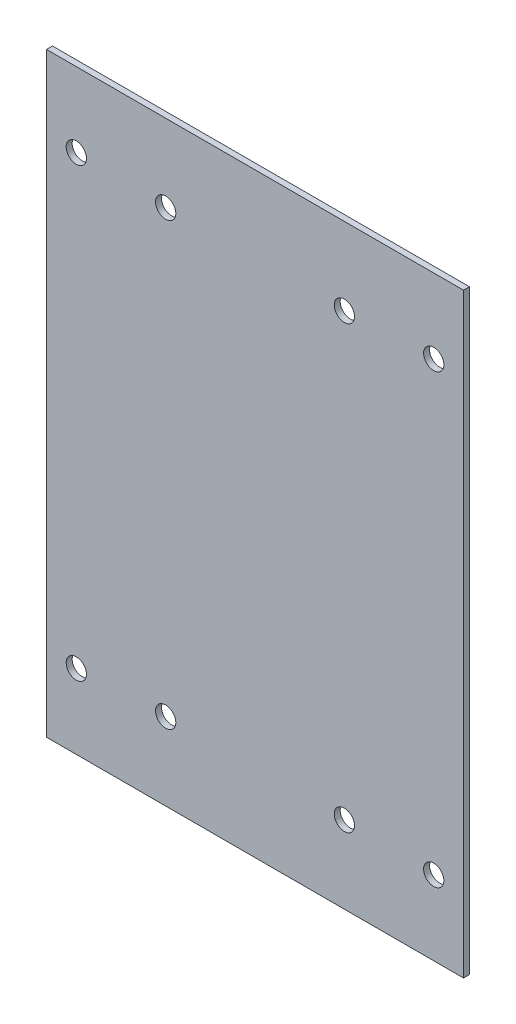
ISO-10303-21;
HEADER;
FILE_DESCRIPTION(('STEP AP214'),'2;1');
FILE_NAME('part.step','',(''),(''),'','','');
FILE_SCHEMA(('AUTOMOTIVE_DESIGN { 1 0 10303 214 1 1 1 1 }'));
ENDSEC;
DATA;
#1=APPLICATION_CONTEXT('core data for automotive mechanical design processes');
#2=APPLICATION_PROTOCOL_DEFINITION('international standard','automotive_design',2000,#1);
#3=PRODUCT_CONTEXT('',#1,'mechanical');
#4=PRODUCT('Part','Part','',(#3));
#5=PRODUCT_RELATED_PRODUCT_CATEGORY('part','',(#4));
#6=PRODUCT_DEFINITION_FORMATION('','',#4);
#7=PRODUCT_DEFINITION_CONTEXT('part definition',#1,'design');
#8=PRODUCT_DEFINITION('design','',#6,#7);
#9=PRODUCT_DEFINITION_SHAPE('','',#8);
#10=(LENGTH_UNIT() NAMED_UNIT(*) SI_UNIT(.MILLI.,.METRE.));
#11=(NAMED_UNIT(*) PLANE_ANGLE_UNIT() SI_UNIT($,.RADIAN.));
#12=(NAMED_UNIT(*) SI_UNIT($,.STERADIAN.) SOLID_ANGLE_UNIT());
#13=UNCERTAINTY_MEASURE_WITH_UNIT(LENGTH_MEASURE(1.E-05),#10,'distance_accuracy_value','');
#14=(GEOMETRIC_REPRESENTATION_CONTEXT(3) GLOBAL_UNCERTAINTY_ASSIGNED_CONTEXT((#13)) GLOBAL_UNIT_ASSIGNED_CONTEXT((#10,
#11,#12)) REPRESENTATION_CONTEXT('',''));
#15=CARTESIAN_POINT('',(0.,0.,0.));
#16=DIRECTION('',(0.,0.,1.));
#17=DIRECTION('',(1.,0.,0.));
#18=AXIS2_PLACEMENT_3D('',#15,#16,#17);
#19=CARTESIAN_POINT('',(0.,0.,0.));
#20=DIRECTION('',(0.,0.,-1.));
#21=DIRECTION('',(-1.,0.,0.));
#22=AXIS2_PLACEMENT_3D('',#19,#20,#21);
#23=PLANE('',#22);
#24=CARTESIAN_POINT('',(-15.,37.,0.));
#25=DIRECTION('',(0.,0.,-1.));
#26=DIRECTION('',(-1.,0.,0.));
#27=AXIS2_PLACEMENT_3D('',#24,#25,#26);
#28=CIRCLE('',#27,1.7);
#29=CARTESIAN_POINT('',(-16.7,37.,0.));
#30=VERTEX_POINT('',#29);
#31=EDGE_CURVE('E267',#30,#30,#28,.F.);
#32=ORIENTED_EDGE('',*,*,#31,.F.);
#33=EDGE_LOOP('',(#32));
#34=FACE_BOUND('',#33,.T.);
#35=CARTESIAN_POINT('',(15.,-37.,0.));
#36=DIRECTION('',(0.,0.,-1.));
#37=DIRECTION('',(-1.,0.,0.));
#38=AXIS2_PLACEMENT_3D('',#35,#36,#37);
#39=CIRCLE('',#38,1.7);
#40=CARTESIAN_POINT('',(13.3,-37.,0.));
#41=VERTEX_POINT('',#40);
#42=EDGE_CURVE('E272',#41,#41,#39,.F.);
#43=ORIENTED_EDGE('',*,*,#42,.F.);
#44=EDGE_LOOP('',(#43));
#45=FACE_BOUND('',#44,.T.);
#46=CARTESIAN_POINT('',(15.,37.,0.));
#47=DIRECTION('',(0.,0.,-1.));
#48=DIRECTION('',(-1.,0.,0.));
#49=AXIS2_PLACEMENT_3D('',#46,#47,#48);
#50=CIRCLE('',#49,1.7);
#51=CARTESIAN_POINT('',(13.3,37.,0.));
#52=VERTEX_POINT('',#51);
#53=EDGE_CURVE('E277',#52,#52,#50,.F.);
#54=ORIENTED_EDGE('',*,*,#53,.F.);
#55=EDGE_LOOP('',(#54));
#56=FACE_BOUND('',#55,.T.);
#57=CARTESIAN_POINT('',(-15.,-37.,0.));
#58=DIRECTION('',(0.,0.,-1.));
#59=DIRECTION('',(-1.,0.,0.));
#60=AXIS2_PLACEMENT_3D('',#57,#58,#59);
#61=CIRCLE('',#60,1.7);
#62=CARTESIAN_POINT('',(-16.7,-37.,0.));
#63=VERTEX_POINT('',#62);
#64=EDGE_CURVE('E276',#63,#63,#61,.F.);
#65=ORIENTED_EDGE('',*,*,#64,.F.);
#66=EDGE_LOOP('',(#65));
#67=FACE_BOUND('',#66,.T.);
#68=DIRECTION('',(0.,1.,0.));
#69=VECTOR('',#68,1.);
#70=CARTESIAN_POINT('',(35.,-50.,0.));
#71=LINE('',#70,#69);
#72=CARTESIAN_POINT('',(35.,-50.,0.));
#73=VERTEX_POINT('',#72);
#74=CARTESIAN_POINT('',(35.,50.,0.));
#75=VERTEX_POINT('',#74);
#76=EDGE_CURVE('E108',#73,#75,#71,.T.);
#77=ORIENTED_EDGE('',*,*,#76,.T.);
#78=DIRECTION('',(-1.,0.,0.));
#79=VECTOR('',#78,1.);
#80=CARTESIAN_POINT('',(-35.,50.,0.));
#81=LINE('',#80,#79);
#82=CARTESIAN_POINT('',(-35.,50.,0.));
#83=VERTEX_POINT('',#82);
#84=EDGE_CURVE('E115',#75,#83,#81,.T.);
#85=ORIENTED_EDGE('',*,*,#84,.T.);
#86=DIRECTION('',(0.,-1.,0.));
#87=VECTOR('',#86,1.);
#88=CARTESIAN_POINT('',(-35.,-50.,0.));
#89=LINE('',#88,#87);
#90=CARTESIAN_POINT('',(-35.,-50.,0.));
#91=VERTEX_POINT('',#90);
#92=EDGE_CURVE('E91',#83,#91,#89,.T.);
#93=ORIENTED_EDGE('',*,*,#92,.T.);
#94=DIRECTION('',(1.,0.,0.));
#95=VECTOR('',#94,1.);
#96=CARTESIAN_POINT('',(-35.,-50.,0.));
#97=LINE('',#96,#95);
#98=EDGE_CURVE('E102',#91,#73,#97,.T.);
#99=ORIENTED_EDGE('',*,*,#98,.T.);
#100=EDGE_LOOP('',(#77,#85,#93,#99));
#101=FACE_BOUND('',#100,.T.);
#102=CARTESIAN_POINT('',(-30.,-37.5,1.2E-05));
#103=DIRECTION('',(0.,0.,1.));
#104=DIRECTION('',(1.,0.,0.));
#105=AXIS2_PLACEMENT_3D('',#102,#103,#104);
#106=CIRCLE('',#105,1.7);
#107=CARTESIAN_POINT('',(-28.3,-37.5,1.2E-05));
#108=VERTEX_POINT('',#107);
#109=EDGE_CURVE('E114',#108,#108,#106,.T.);
#110=ORIENTED_EDGE('',*,*,#109,.F.);
#111=EDGE_LOOP('',(#110));
#112=FACE_BOUND('',#111,.T.);
#113=CARTESIAN_POINT('',(30.,37.5,1.2E-05));
#114=DIRECTION('',(0.,0.,1.));
#115=DIRECTION('',(1.,0.,0.));
#116=AXIS2_PLACEMENT_3D('',#113,#114,#115);
#117=CIRCLE('',#116,1.7);
#118=CARTESIAN_POINT('',(31.7,37.5,1.2E-05));
#119=VERTEX_POINT('',#118);
#120=EDGE_CURVE('E222',#119,#119,#117,.T.);
#121=ORIENTED_EDGE('',*,*,#120,.F.);
#122=EDGE_LOOP('',(#121));
#123=FACE_BOUND('',#122,.T.);
#124=CARTESIAN_POINT('',(30.,-37.5,1.2E-05));
#125=DIRECTION('',(0.,0.,1.));
#126=DIRECTION('',(1.,0.,0.));
#127=AXIS2_PLACEMENT_3D('',#124,#125,#126);
#128=CIRCLE('',#127,1.7);
#129=CARTESIAN_POINT('',(31.7,-37.5,1.2E-05));
#130=VERTEX_POINT('',#129);
#131=EDGE_CURVE('E160',#130,#130,#128,.T.);
#132=ORIENTED_EDGE('',*,*,#131,.F.);
#133=EDGE_LOOP('',(#132));
#134=FACE_BOUND('',#133,.T.);
#135=CARTESIAN_POINT('',(-30.,37.5,1.2E-05));
#136=DIRECTION('',(0.,0.,1.));
#137=DIRECTION('',(1.,0.,0.));
#138=AXIS2_PLACEMENT_3D('',#135,#136,#137);
#139=CIRCLE('',#138,1.7);
#140=CARTESIAN_POINT('',(-28.3,37.5,1.2E-05));
#141=VERTEX_POINT('',#140);
#142=EDGE_CURVE('E169',#141,#141,#139,.T.);
#143=ORIENTED_EDGE('',*,*,#142,.F.);
#144=EDGE_LOOP('',(#143));
#145=FACE_BOUND('',#144,.T.);
#146=ADVANCED_FACE('F39',(#34,#45,#56,#67,#101,#112,#123,#134,#145),#23,.F.);
#147=CARTESIAN_POINT('',(35.,-50.,-1.));
#148=DIRECTION('',(1.,0.,0.));
#149=DIRECTION('',(0.,0.,-1.));
#150=AXIS2_PLACEMENT_3D('',#147,#148,#149);
#151=PLANE('',#150);
#152=ORIENTED_EDGE('',*,*,#76,.F.);
#153=DIRECTION('',(0.,0.,1.));
#154=VECTOR('',#153,1.);
#155=CARTESIAN_POINT('',(35.,-50.,-1.));
#156=LINE('',#155,#154);
#157=CARTESIAN_POINT('',(35.,-50.,-1.));
#158=VERTEX_POINT('',#157);
#159=EDGE_CURVE('E11',#158,#73,#156,.T.);
#160=ORIENTED_EDGE('',*,*,#159,.F.);
#161=DIRECTION('',(0.,1.,0.));
#162=VECTOR('',#161,1.);
#163=CARTESIAN_POINT('',(35.,-50.,-1.));
#164=LINE('',#163,#162);
#165=CARTESIAN_POINT('',(35.,50.,-1.));
#166=VERTEX_POINT('',#165);
#167=EDGE_CURVE('E105',#158,#166,#164,.T.);
#168=ORIENTED_EDGE('',*,*,#167,.T.);
#169=DIRECTION('',(0.,0.,1.));
#170=VECTOR('',#169,1.);
#171=CARTESIAN_POINT('',(35.,50.,-1.));
#172=LINE('',#171,#170);
#173=EDGE_CURVE('E83',#166,#75,#172,.T.);
#174=ORIENTED_EDGE('',*,*,#173,.T.);
#175=EDGE_LOOP('',(#152,#160,#168,#174));
#176=FACE_BOUND('',#175,.T.);
#177=ADVANCED_FACE('F41',(#176),#151,.T.);
#178=CARTESIAN_POINT('',(-35.,-50.,-1.));
#179=DIRECTION('',(0.,-1.,0.));
#180=DIRECTION('',(0.,0.,-1.));
#181=AXIS2_PLACEMENT_3D('',#178,#179,#180);
#182=PLANE('',#181);
#183=ORIENTED_EDGE('',*,*,#98,.F.);
#184=DIRECTION('',(0.,0.,1.));
#185=VECTOR('',#184,1.);
#186=CARTESIAN_POINT('',(-35.,-50.,-1.));
#187=LINE('',#186,#185);
#188=CARTESIAN_POINT('',(-35.,-50.,-1.));
#189=VERTEX_POINT('',#188);
#190=EDGE_CURVE('E51',#189,#91,#187,.T.);
#191=ORIENTED_EDGE('',*,*,#190,.F.);
#192=DIRECTION('',(1.,0.,0.));
#193=VECTOR('',#192,1.);
#194=CARTESIAN_POINT('',(-35.,-50.,-1.));
#195=LINE('',#194,#193);
#196=EDGE_CURVE('E97',#189,#158,#195,.T.);
#197=ORIENTED_EDGE('',*,*,#196,.T.);
#198=ORIENTED_EDGE('',*,*,#159,.T.);
#199=EDGE_LOOP('',(#183,#191,#197,#198));
#200=FACE_BOUND('',#199,.T.);
#201=ADVANCED_FACE('F138',(#200),#182,.T.);
#202=CARTESIAN_POINT('',(-35.,-50.,-1.));
#203=DIRECTION('',(-1.,0.,0.));
#204=DIRECTION('',(0.,0.,1.));
#205=AXIS2_PLACEMENT_3D('',#202,#203,#204);
#206=PLANE('',#205);
#207=ORIENTED_EDGE('',*,*,#92,.F.);
#208=DIRECTION('',(0.,0.,1.));
#209=VECTOR('',#208,1.);
#210=CARTESIAN_POINT('',(-35.,50.,-1.));
#211=LINE('',#210,#209);
#212=CARTESIAN_POINT('',(-35.,50.,-1.));
#213=VERTEX_POINT('',#212);
#214=EDGE_CURVE('E86',#213,#83,#211,.T.);
#215=ORIENTED_EDGE('',*,*,#214,.F.);
#216=DIRECTION('',(0.,-1.,0.));
#217=VECTOR('',#216,1.);
#218=CARTESIAN_POINT('',(-35.,-50.,-1.));
#219=LINE('',#218,#217);
#220=EDGE_CURVE('E93',#213,#189,#219,.T.);
#221=ORIENTED_EDGE('',*,*,#220,.T.);
#222=ORIENTED_EDGE('',*,*,#190,.T.);
#223=EDGE_LOOP('',(#207,#215,#221,#222));
#224=FACE_BOUND('',#223,.T.);
#225=ADVANCED_FACE('F89',(#224),#206,.T.);
#226=CARTESIAN_POINT('',(-35.,50.,-1.));
#227=DIRECTION('',(0.,1.,0.));
#228=DIRECTION('',(0.,0.,1.));
#229=AXIS2_PLACEMENT_3D('',#226,#227,#228);
#230=PLANE('',#229);
#231=ORIENTED_EDGE('',*,*,#84,.F.);
#232=ORIENTED_EDGE('',*,*,#173,.F.);
#233=DIRECTION('',(-1.,0.,0.));
#234=VECTOR('',#233,1.);
#235=CARTESIAN_POINT('',(-35.,50.,-1.));
#236=LINE('',#235,#234);
#237=EDGE_CURVE('E98',#166,#213,#236,.T.);
#238=ORIENTED_EDGE('',*,*,#237,.T.);
#239=ORIENTED_EDGE('',*,*,#214,.T.);
#240=EDGE_LOOP('',(#231,#232,#238,#239));
#241=FACE_BOUND('',#240,.T.);
#242=ADVANCED_FACE('F101',(#241),#230,.T.);
#243=CARTESIAN_POINT('',(0.,0.,-1.));
#244=DIRECTION('',(0.,0.,-1.));
#245=DIRECTION('',(-1.,0.,0.));
#246=AXIS2_PLACEMENT_3D('',#243,#244,#245);
#247=PLANE('',#246);
#248=CARTESIAN_POINT('',(-15.,37.,-1.));
#249=DIRECTION('',(0.,0.,1.));
#250=DIRECTION('',(1.,0.,0.));
#251=AXIS2_PLACEMENT_3D('',#248,#249,#250);
#252=CIRCLE('',#251,1.7);
#253=CARTESIAN_POINT('',(-13.3,37.,-1.));
#254=VERTEX_POINT('',#253);
#255=EDGE_CURVE('E253',#254,#254,#252,.T.);
#256=ORIENTED_EDGE('',*,*,#255,.T.);
#257=EDGE_LOOP('',(#256));
#258=FACE_BOUND('',#257,.T.);
#259=CARTESIAN_POINT('',(15.,-37.,-1.));
#260=DIRECTION('',(0.,0.,1.));
#261=DIRECTION('',(1.,0.,0.));
#262=AXIS2_PLACEMENT_3D('',#259,#260,#261);
#263=CIRCLE('',#262,1.7);
#264=CARTESIAN_POINT('',(16.7,-37.,-1.));
#265=VERTEX_POINT('',#264);
#266=EDGE_CURVE('E254',#265,#265,#263,.T.);
#267=ORIENTED_EDGE('',*,*,#266,.T.);
#268=EDGE_LOOP('',(#267));
#269=FACE_BOUND('',#268,.T.);
#270=CARTESIAN_POINT('',(15.,37.,-1.));
#271=DIRECTION('',(0.,0.,1.));
#272=DIRECTION('',(1.,0.,0.));
#273=AXIS2_PLACEMENT_3D('',#270,#271,#272);
#274=CIRCLE('',#273,1.7);
#275=CARTESIAN_POINT('',(16.7,37.,-1.));
#276=VERTEX_POINT('',#275);
#277=EDGE_CURVE('E259',#276,#276,#274,.T.);
#278=ORIENTED_EDGE('',*,*,#277,.T.);
#279=EDGE_LOOP('',(#278));
#280=FACE_BOUND('',#279,.T.);
#281=CARTESIAN_POINT('',(-15.,-37.,-1.));
#282=DIRECTION('',(0.,0.,1.));
#283=DIRECTION('',(1.,0.,0.));
#284=AXIS2_PLACEMENT_3D('',#281,#282,#283);
#285=CIRCLE('',#284,1.7);
#286=CARTESIAN_POINT('',(-13.3,-37.,-1.));
#287=VERTEX_POINT('',#286);
#288=EDGE_CURVE('E263',#287,#287,#285,.T.);
#289=ORIENTED_EDGE('',*,*,#288,.T.);
#290=EDGE_LOOP('',(#289));
#291=FACE_BOUND('',#290,.T.);
#292=CARTESIAN_POINT('',(-30.,37.5,-1.));
#293=DIRECTION('',(0.,0.,1.));
#294=DIRECTION('',(1.,0.,0.));
#295=AXIS2_PLACEMENT_3D('',#292,#293,#294);
#296=CIRCLE('',#295,1.7);
#297=CARTESIAN_POINT('',(-28.3,37.5,-1.));
#298=VERTEX_POINT('',#297);
#299=EDGE_CURVE('E173',#298,#298,#296,.T.);
#300=ORIENTED_EDGE('',*,*,#299,.T.);
#301=EDGE_LOOP('',(#300));
#302=FACE_BOUND('',#301,.T.);
#303=CARTESIAN_POINT('',(30.,-37.5,-1.));
#304=DIRECTION('',(0.,0.,1.));
#305=DIRECTION('',(1.,0.,0.));
#306=AXIS2_PLACEMENT_3D('',#303,#304,#305);
#307=CIRCLE('',#306,1.7);
#308=CARTESIAN_POINT('',(31.7,-37.5,-1.));
#309=VERTEX_POINT('',#308);
#310=EDGE_CURVE('E175',#309,#309,#307,.T.);
#311=ORIENTED_EDGE('',*,*,#310,.T.);
#312=EDGE_LOOP('',(#311));
#313=FACE_BOUND('',#312,.T.);
#314=CARTESIAN_POINT('',(30.,37.5,-1.));
#315=DIRECTION('',(0.,0.,1.));
#316=DIRECTION('',(1.,0.,0.));
#317=AXIS2_PLACEMENT_3D('',#314,#315,#316);
#318=CIRCLE('',#317,1.7);
#319=CARTESIAN_POINT('',(31.7,37.5,-1.));
#320=VERTEX_POINT('',#319);
#321=EDGE_CURVE('E178',#320,#320,#318,.T.);
#322=ORIENTED_EDGE('',*,*,#321,.T.);
#323=EDGE_LOOP('',(#322));
#324=FACE_BOUND('',#323,.T.);
#325=CARTESIAN_POINT('',(-30.,-37.5,-1.));
#326=DIRECTION('',(0.,0.,1.));
#327=DIRECTION('',(1.,0.,0.));
#328=AXIS2_PLACEMENT_3D('',#325,#326,#327);
#329=CIRCLE('',#328,1.7);
#330=CARTESIAN_POINT('',(-28.3,-37.5,-1.));
#331=VERTEX_POINT('',#330);
#332=EDGE_CURVE('E172',#331,#331,#329,.T.);
#333=ORIENTED_EDGE('',*,*,#332,.T.);
#334=EDGE_LOOP('',(#333));
#335=FACE_BOUND('',#334,.T.);
#336=ORIENTED_EDGE('',*,*,#167,.F.);
#337=ORIENTED_EDGE('',*,*,#196,.F.);
#338=ORIENTED_EDGE('',*,*,#220,.F.);
#339=ORIENTED_EDGE('',*,*,#237,.F.);
#340=EDGE_LOOP('',(#336,#337,#338,#339));
#341=FACE_BOUND('',#340,.T.);
#342=ADVANCED_FACE('F100',(#258,#269,#280,#291,#302,#313,#324,#335,#341),#247,.T.);
#343=CARTESIAN_POINT('',(-30.,-37.5,1.2E-05));
#344=DIRECTION('',(0.,0.,-1.));
#345=DIRECTION('',(-1.,0.,0.));
#346=AXIS2_PLACEMENT_3D('',#343,#344,#345);
#347=CYLINDRICAL_SURFACE('',#346,1.7);
#348=ORIENTED_EDGE('',*,*,#109,.T.);
#349=EDGE_LOOP('',(#348));
#350=FACE_BOUND('',#349,.T.);
#351=ORIENTED_EDGE('',*,*,#332,.F.);
#352=EDGE_LOOP('',(#351));
#353=FACE_BOUND('',#352,.T.);
#354=ADVANCED_FACE('F208',(#350,#353),#347,.F.);
#355=CARTESIAN_POINT('',(30.,37.5,1.2E-05));
#356=DIRECTION('',(0.,0.,-1.));
#357=DIRECTION('',(-1.,0.,0.));
#358=AXIS2_PLACEMENT_3D('',#355,#356,#357);
#359=CYLINDRICAL_SURFACE('',#358,1.7);
#360=ORIENTED_EDGE('',*,*,#120,.T.);
#361=EDGE_LOOP('',(#360));
#362=FACE_BOUND('',#361,.T.);
#363=ORIENTED_EDGE('',*,*,#321,.F.);
#364=EDGE_LOOP('',(#363));
#365=FACE_BOUND('',#364,.T.);
#366=ADVANCED_FACE('F205',(#362,#365),#359,.F.);
#367=CARTESIAN_POINT('',(30.,-37.5,1.2E-05));
#368=DIRECTION('',(0.,0.,-1.));
#369=DIRECTION('',(-1.,0.,0.));
#370=AXIS2_PLACEMENT_3D('',#367,#368,#369);
#371=CYLINDRICAL_SURFACE('',#370,1.7);
#372=ORIENTED_EDGE('',*,*,#131,.T.);
#373=EDGE_LOOP('',(#372));
#374=FACE_BOUND('',#373,.T.);
#375=ORIENTED_EDGE('',*,*,#310,.F.);
#376=EDGE_LOOP('',(#375));
#377=FACE_BOUND('',#376,.T.);
#378=ADVANCED_FACE('F203',(#374,#377),#371,.F.);
#379=CARTESIAN_POINT('',(-30.,37.5,1.2E-05));
#380=DIRECTION('',(0.,0.,-1.));
#381=DIRECTION('',(-1.,0.,0.));
#382=AXIS2_PLACEMENT_3D('',#379,#380,#381);
#383=CYLINDRICAL_SURFACE('',#382,1.7);
#384=ORIENTED_EDGE('',*,*,#142,.T.);
#385=EDGE_LOOP('',(#384));
#386=FACE_BOUND('',#385,.T.);
#387=ORIENTED_EDGE('',*,*,#299,.F.);
#388=EDGE_LOOP('',(#387));
#389=FACE_BOUND('',#388,.T.);
#390=ADVANCED_FACE('F189',(#386,#389),#383,.F.);
#391=CARTESIAN_POINT('',(-15.,-37.,0.0826770233145147));
#392=DIRECTION('',(0.,0.,-1.));
#393=DIRECTION('',(-1.,0.,0.));
#394=AXIS2_PLACEMENT_3D('',#391,#392,#393);
#395=CYLINDRICAL_SURFACE('',#394,1.7);
#396=ORIENTED_EDGE('',*,*,#288,.F.);
#397=EDGE_LOOP('',(#396));
#398=FACE_BOUND('',#397,.T.);
#399=ORIENTED_EDGE('',*,*,#64,.T.);
#400=EDGE_LOOP('',(#399));
#401=FACE_BOUND('',#400,.T.);
#402=ADVANCED_FACE('F199',(#398,#401),#395,.F.);
#403=CARTESIAN_POINT('',(15.,37.,0.0826770233145147));
#404=DIRECTION('',(0.,0.,-1.));
#405=DIRECTION('',(-1.,0.,0.));
#406=AXIS2_PLACEMENT_3D('',#403,#404,#405);
#407=CYLINDRICAL_SURFACE('',#406,1.7);
#408=ORIENTED_EDGE('',*,*,#277,.F.);
#409=EDGE_LOOP('',(#408));
#410=FACE_BOUND('',#409,.T.);
#411=ORIENTED_EDGE('',*,*,#53,.T.);
#412=EDGE_LOOP('',(#411));
#413=FACE_BOUND('',#412,.T.);
#414=ADVANCED_FACE('F359',(#410,#413),#407,.F.);
#415=CARTESIAN_POINT('',(15.,-37.,0.0826770233145147));
#416=DIRECTION('',(0.,0.,-1.));
#417=DIRECTION('',(-1.,0.,0.));
#418=AXIS2_PLACEMENT_3D('',#415,#416,#417);
#419=CYLINDRICAL_SURFACE('',#418,1.7);
#420=ORIENTED_EDGE('',*,*,#266,.F.);
#421=EDGE_LOOP('',(#420));
#422=FACE_BOUND('',#421,.T.);
#423=ORIENTED_EDGE('',*,*,#42,.T.);
#424=EDGE_LOOP('',(#423));
#425=FACE_BOUND('',#424,.T.);
#426=ADVANCED_FACE('F368',(#422,#425),#419,.F.);
#427=CARTESIAN_POINT('',(-15.,37.,0.0826770233145147));
#428=DIRECTION('',(0.,0.,-1.));
#429=DIRECTION('',(-1.,0.,0.));
#430=AXIS2_PLACEMENT_3D('',#427,#428,#429);
#431=CYLINDRICAL_SURFACE('',#430,1.7);
#432=ORIENTED_EDGE('',*,*,#255,.F.);
#433=EDGE_LOOP('',(#432));
#434=FACE_BOUND('',#433,.T.);
#435=ORIENTED_EDGE('',*,*,#31,.T.);
#436=EDGE_LOOP('',(#435));
#437=FACE_BOUND('',#436,.T.);
#438=ADVANCED_FACE('F376',(#434,#437),#431,.F.);
#439=CLOSED_SHELL('',(#146,#177,#201,#225,#242,#342,#354,#366,#378,#390,#402,#414,#426,#438));
#440=MANIFOLD_SOLID_BREP('B2',#439);
#441=ADVANCED_BREP_SHAPE_REPRESENTATION('',(#18,#440),#14);
#442=SHAPE_DEFINITION_REPRESENTATION(#9,#441);
ENDSEC;
END-ISO-10303-21;
